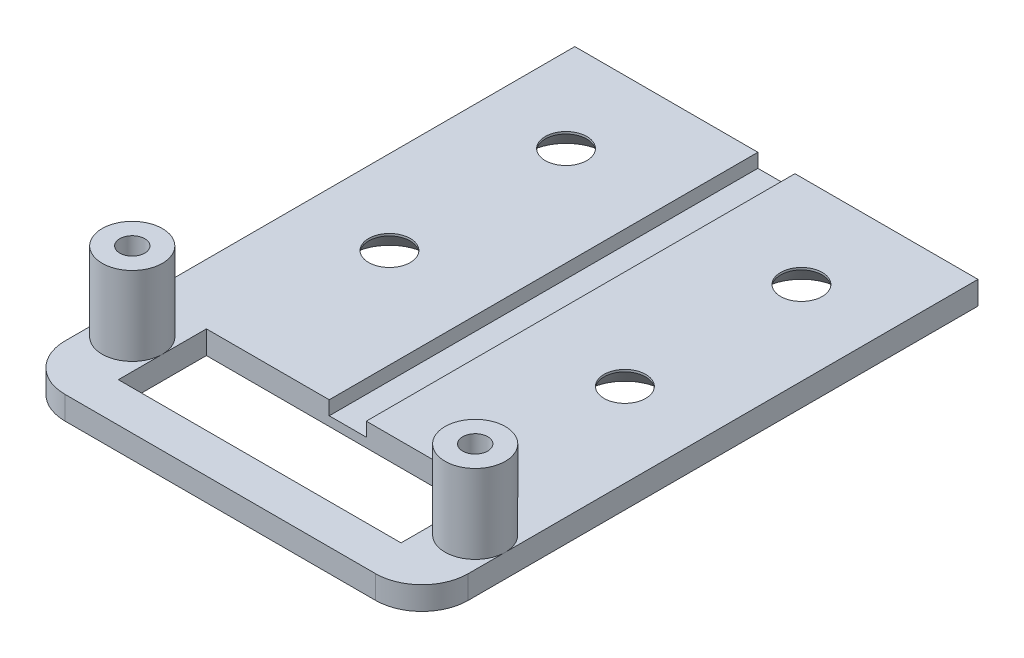
ISO-10303-21;
HEADER;
FILE_DESCRIPTION(('STEP AP214'),'2;1');
FILE_NAME('part.step','',(''),(''),'','','');
FILE_SCHEMA(('AUTOMOTIVE_DESIGN { 1 0 10303 214 1 1 1 1 }'));
ENDSEC;
DATA;
#1=APPLICATION_CONTEXT('core data for automotive mechanical design processes');
#2=APPLICATION_PROTOCOL_DEFINITION('international standard','automotive_design',2000,#1);
#3=PRODUCT_CONTEXT('',#1,'mechanical');
#4=PRODUCT('Part','Part','',(#3));
#5=PRODUCT_RELATED_PRODUCT_CATEGORY('part','',(#4));
#6=PRODUCT_DEFINITION_FORMATION('','',#4);
#7=PRODUCT_DEFINITION_CONTEXT('part definition',#1,'design');
#8=PRODUCT_DEFINITION('design','',#6,#7);
#9=PRODUCT_DEFINITION_SHAPE('','',#8);
#10=(LENGTH_UNIT() NAMED_UNIT(*) SI_UNIT(.MILLI.,.METRE.));
#11=(NAMED_UNIT(*) PLANE_ANGLE_UNIT() SI_UNIT($,.RADIAN.));
#12=(NAMED_UNIT(*) SI_UNIT($,.STERADIAN.) SOLID_ANGLE_UNIT());
#13=UNCERTAINTY_MEASURE_WITH_UNIT(LENGTH_MEASURE(1.E-05),#10,'distance_accuracy_value','');
#14=(GEOMETRIC_REPRESENTATION_CONTEXT(3) GLOBAL_UNCERTAINTY_ASSIGNED_CONTEXT((#13)) GLOBAL_UNIT_ASSIGNED_CONTEXT((#10,
#11,#12)) REPRESENTATION_CONTEXT('',''));
#15=CARTESIAN_POINT('',(0.,0.,0.));
#16=DIRECTION('',(0.,0.,1.));
#17=DIRECTION('',(1.,0.,0.));
#18=AXIS2_PLACEMENT_3D('',#15,#16,#17);
#19=CARTESIAN_POINT('',(0.,2.5,0.));
#20=DIRECTION('',(0.,1.,0.));
#21=DIRECTION('',(0.,0.,1.));
#22=AXIS2_PLACEMENT_3D('',#19,#20,#21);
#23=PLANE('',#22);
#24=CARTESIAN_POINT('',(12.7,2.5,-0.95));
#25=DIRECTION('',(0.,1.,0.));
#26=DIRECTION('',(0.,0.,1.));
#27=AXIS2_PLACEMENT_3D('',#24,#25,#26);
#28=CIRCLE('',#27,2.2479);
#29=CARTESIAN_POINT('',(12.7,2.5,1.2979));
#30=VERTEX_POINT('',#29);
#31=EDGE_CURVE('E37',#30,#30,#28,.T.);
#32=ORIENTED_EDGE('',*,*,#31,.F.);
#33=EDGE_LOOP('',(#32));
#34=FACE_BOUND('',#33,.T.);
#35=CARTESIAN_POINT('',(12.7,2.5,-20.));
#36=DIRECTION('',(0.,1.,0.));
#37=DIRECTION('',(0.,0.,1.));
#38=AXIS2_PLACEMENT_3D('',#35,#36,#37);
#39=CIRCLE('',#38,2.2479);
#40=CARTESIAN_POINT('',(12.7,2.5,-17.7521));
#41=VERTEX_POINT('',#40);
#42=EDGE_CURVE('E295',#41,#41,#39,.T.);
#43=ORIENTED_EDGE('',*,*,#42,.F.);
#44=EDGE_LOOP('',(#43));
#45=FACE_BOUND('',#44,.T.);
#46=DIRECTION('',(0.,0.,-1.));
#47=VECTOR('',#46,1.);
#48=CARTESIAN_POINT('',(2.,2.5,16.25));
#49=LINE('',#48,#47);
#50=CARTESIAN_POINT('',(2.,2.5,16.25));
#51=VERTEX_POINT('',#50);
#52=CARTESIAN_POINT('',(2.,2.5,-30.));
#53=VERTEX_POINT('',#52);
#54=EDGE_CURVE('E154',#51,#53,#49,.T.);
#55=ORIENTED_EDGE('',*,*,#54,.F.);
#56=DIRECTION('',(-1.,0.,0.));
#57=VECTOR('',#56,1.);
#58=CARTESIAN_POINT('',(-15.25,2.5,16.25));
#59=LINE('',#58,#57);
#60=CARTESIAN_POINT('',(15.25,2.5,16.25));
#61=VERTEX_POINT('',#60);
#62=EDGE_CURVE('E229',#61,#51,#59,.T.);
#63=ORIENTED_EDGE('',*,*,#62,.F.);
#64=DIRECTION('',(0.,0.,-1.));
#65=VECTOR('',#64,1.);
#66=CARTESIAN_POINT('',(15.25,2.5,16.25));
#67=LINE('',#66,#65);
#68=CARTESIAN_POINT('',(15.25,2.5,21.));
#69=VERTEX_POINT('',#68);
#70=EDGE_CURVE('E207',#69,#61,#67,.T.);
#71=ORIENTED_EDGE('',*,*,#70,.F.);
#72=CARTESIAN_POINT('',(18.5,2.5,21.));
#73=DIRECTION('',(0.,1.,0.));
#74=DIRECTION('',(0.,0.,1.));
#75=AXIS2_PLACEMENT_3D('',#72,#73,#74);
#76=CIRCLE('',#75,3.25);
#77=CARTESIAN_POINT('',(21.75,2.5,21.));
#78=VERTEX_POINT('',#77);
#79=EDGE_CURVE('E202',#78,#69,#76,.T.);
#80=ORIENTED_EDGE('',*,*,#79,.F.);
#81=DIRECTION('',(0.,0.,-1.));
#82=VECTOR('',#81,1.);
#83=CARTESIAN_POINT('',(21.75,2.5,30.));
#84=LINE('',#83,#82);
#85=CARTESIAN_POINT('',(21.75,2.5,-30.));
#86=VERTEX_POINT('',#85);
#87=EDGE_CURVE('E254',#78,#86,#84,.T.);
#88=ORIENTED_EDGE('',*,*,#87,.T.);
#89=DIRECTION('',(-1.,0.,0.));
#90=VECTOR('',#89,1.);
#91=CARTESIAN_POINT('',(21.75,2.5,-30.));
#92=LINE('',#91,#90);
#93=EDGE_CURVE('E258',#86,#53,#92,.T.);
#94=ORIENTED_EDGE('',*,*,#93,.T.);
#95=EDGE_LOOP('',(#55,#63,#71,#80,#88,#94));
#96=FACE_BOUND('',#95,.T.);
#97=ADVANCED_FACE('F33',(#34,#45,#96),#23,.T.);
#98=CARTESIAN_POINT('',(-12.7,2.5,-0.95));
#99=DIRECTION('',(0.,1.,0.));
#100=DIRECTION('',(0.,0.,1.));
#101=AXIS2_PLACEMENT_3D('',#98,#99,#100);
#102=CIRCLE('',#101,2.2479);
#103=CARTESIAN_POINT('',(-12.7,2.5,1.2979));
#104=VERTEX_POINT('',#103);
#105=EDGE_CURVE('E291',#104,#104,#102,.T.);
#106=ORIENTED_EDGE('',*,*,#105,.F.);
#107=EDGE_LOOP('',(#106));
#108=FACE_BOUND('',#107,.T.);
#109=CARTESIAN_POINT('',(-12.7,2.5,-20.));
#110=DIRECTION('',(0.,1.,0.));
#111=DIRECTION('',(0.,0.,1.));
#112=AXIS2_PLACEMENT_3D('',#109,#110,#111);
#113=CIRCLE('',#112,2.2479);
#114=CARTESIAN_POINT('',(-12.7,2.5,-17.7521));
#115=VERTEX_POINT('',#114);
#116=EDGE_CURVE('E177',#115,#115,#113,.T.);
#117=ORIENTED_EDGE('',*,*,#116,.F.);
#118=EDGE_LOOP('',(#117));
#119=FACE_BOUND('',#118,.T.);
#120=DIRECTION('',(0.,0.,1.));
#121=VECTOR('',#120,1.);
#122=CARTESIAN_POINT('',(-2.,2.5,16.25));
#123=LINE('',#122,#121);
#124=CARTESIAN_POINT('',(-2.,2.5,-30.));
#125=VERTEX_POINT('',#124);
#126=CARTESIAN_POINT('',(-2.,2.5,16.25));
#127=VERTEX_POINT('',#126);
#128=EDGE_CURVE('E167',#125,#127,#123,.T.);
#129=ORIENTED_EDGE('',*,*,#128,.F.);
#130=CARTESIAN_POINT('',(-21.75,2.5,-30.));
#131=VERTEX_POINT('',#130);
#132=EDGE_CURVE('E257',#125,#131,#92,.T.);
#133=ORIENTED_EDGE('',*,*,#132,.T.);
#134=DIRECTION('',(0.,0.,1.));
#135=VECTOR('',#134,1.);
#136=CARTESIAN_POINT('',(-21.75,2.5,30.));
#137=LINE('',#136,#135);
#138=CARTESIAN_POINT('',(-21.75,2.5,21.));
#139=VERTEX_POINT('',#138);
#140=EDGE_CURVE('E248',#131,#139,#137,.T.);
#141=ORIENTED_EDGE('',*,*,#140,.T.);
#142=CARTESIAN_POINT('',(-18.5,2.5,21.));
#143=DIRECTION('',(0.,1.,0.));
#144=DIRECTION('',(0.,0.,1.));
#145=AXIS2_PLACEMENT_3D('',#142,#143,#144);
#146=CIRCLE('',#145,3.25);
#147=CARTESIAN_POINT('',(-15.25,2.5,21.));
#148=VERTEX_POINT('',#147);
#149=EDGE_CURVE('E201',#148,#139,#146,.T.);
#150=ORIENTED_EDGE('',*,*,#149,.F.);
#151=DIRECTION('',(0.,0.,1.));
#152=VECTOR('',#151,1.);
#153=CARTESIAN_POINT('',(-15.25,2.5,16.25));
#154=LINE('',#153,#152);
#155=CARTESIAN_POINT('',(-15.25,2.5,16.25));
#156=VERTEX_POINT('',#155);
#157=EDGE_CURVE('E233',#156,#148,#154,.T.);
#158=ORIENTED_EDGE('',*,*,#157,.F.);
#159=EDGE_CURVE('E228',#127,#156,#59,.T.);
#160=ORIENTED_EDGE('',*,*,#159,.F.);
#161=EDGE_LOOP('',(#129,#133,#141,#150,#158,#160));
#162=FACE_BOUND('',#161,.T.);
#163=ADVANCED_FACE('F365',(#108,#119,#162),#23,.T.);
#164=CARTESIAN_POINT('',(-21.75,2.5,30.));
#165=DIRECTION('',(1.,0.,0.));
#166=DIRECTION('',(0.,0.,-1.));
#167=AXIS2_PLACEMENT_3D('',#164,#165,#166);
#168=PLANE('',#167);
#169=DIRECTION('',(0.,0.,1.));
#170=VECTOR('',#169,1.);
#171=CARTESIAN_POINT('',(-21.75,0.,30.));
#172=LINE('',#171,#170);
#173=CARTESIAN_POINT('',(-21.75,0.,-30.));
#174=VERTEX_POINT('',#173);
#175=CARTESIAN_POINT('',(-21.75,0.,25.));
#176=VERTEX_POINT('',#175);
#177=EDGE_CURVE('E239',#174,#176,#172,.T.);
#178=ORIENTED_EDGE('',*,*,#177,.T.);
#179=DIRECTION('',(0.,-1.,0.));
#180=VECTOR('',#179,1.);
#181=CARTESIAN_POINT('',(-21.75,2.5,25.));
#182=LINE('',#181,#180);
#183=CARTESIAN_POINT('',(-21.75,2.5,25.));
#184=VERTEX_POINT('',#183);
#185=EDGE_CURVE('E284',#176,#184,#182,.F.);
#186=ORIENTED_EDGE('',*,*,#185,.T.);
#187=EDGE_CURVE('E252',#139,#184,#137,.T.);
#188=ORIENTED_EDGE('',*,*,#187,.F.);
#189=ORIENTED_EDGE('',*,*,#140,.F.);
#190=DIRECTION('',(0.,-1.,0.));
#191=VECTOR('',#190,1.);
#192=CARTESIAN_POINT('',(-21.75,2.5,-30.));
#193=LINE('',#192,#191);
#194=EDGE_CURVE('E260',#131,#174,#193,.T.);
#195=ORIENTED_EDGE('',*,*,#194,.T.);
#196=EDGE_LOOP('',(#178,#186,#188,#189,#195));
#197=FACE_BOUND('',#196,.T.);
#198=ADVANCED_FACE('F358',(#197),#168,.F.);
#199=CARTESIAN_POINT('',(21.75,2.5,30.));
#200=DIRECTION('',(0.,0.,-1.));
#201=DIRECTION('',(-1.,0.,0.));
#202=AXIS2_PLACEMENT_3D('',#199,#200,#201);
#203=PLANE('',#202);
#204=DIRECTION('',(1.,0.,0.));
#205=VECTOR('',#204,1.);
#206=CARTESIAN_POINT('',(21.75,2.5,30.));
#207=LINE('',#206,#205);
#208=CARTESIAN_POINT('',(-16.75,2.5,30.));
#209=VERTEX_POINT('',#208);
#210=CARTESIAN_POINT('',(16.75,2.5,30.));
#211=VERTEX_POINT('',#210);
#212=EDGE_CURVE('E251',#209,#211,#207,.T.);
#213=ORIENTED_EDGE('',*,*,#212,.F.);
#214=DIRECTION('',(0.,-1.,0.));
#215=VECTOR('',#214,1.);
#216=CARTESIAN_POINT('',(-16.75,2.5,30.));
#217=LINE('',#216,#215);
#218=CARTESIAN_POINT('',(-16.75,0.,30.));
#219=VERTEX_POINT('',#218);
#220=EDGE_CURVE('E277',#209,#219,#217,.T.);
#221=ORIENTED_EDGE('',*,*,#220,.T.);
#222=DIRECTION('',(1.,0.,0.));
#223=VECTOR('',#222,1.);
#224=CARTESIAN_POINT('',(21.75,0.,30.));
#225=LINE('',#224,#223);
#226=CARTESIAN_POINT('',(16.75,0.,30.));
#227=VERTEX_POINT('',#226);
#228=EDGE_CURVE('E263',#219,#227,#225,.T.);
#229=ORIENTED_EDGE('',*,*,#228,.T.);
#230=DIRECTION('',(0.,-1.,0.));
#231=VECTOR('',#230,1.);
#232=CARTESIAN_POINT('',(16.75,2.5,30.));
#233=LINE('',#232,#231);
#234=EDGE_CURVE('E275',#227,#211,#233,.F.);
#235=ORIENTED_EDGE('',*,*,#234,.T.);
#236=EDGE_LOOP('',(#213,#221,#229,#235));
#237=FACE_BOUND('',#236,.T.);
#238=ADVANCED_FACE('F346',(#237),#203,.F.);
#239=CARTESIAN_POINT('',(21.75,2.5,30.));
#240=DIRECTION('',(-1.,0.,0.));
#241=DIRECTION('',(0.,0.,1.));
#242=AXIS2_PLACEMENT_3D('',#239,#240,#241);
#243=PLANE('',#242);
#244=CARTESIAN_POINT('',(21.75,2.5,25.));
#245=VERTEX_POINT('',#244);
#246=EDGE_CURVE('E255',#245,#78,#84,.T.);
#247=ORIENTED_EDGE('',*,*,#246,.F.);
#248=DIRECTION('',(0.,-1.,0.));
#249=VECTOR('',#248,1.);
#250=CARTESIAN_POINT('',(21.75,2.5,25.));
#251=LINE('',#250,#249);
#252=CARTESIAN_POINT('',(21.75,0.,25.));
#253=VERTEX_POINT('',#252);
#254=EDGE_CURVE('E11',#245,#253,#251,.T.);
#255=ORIENTED_EDGE('',*,*,#254,.T.);
#256=DIRECTION('',(0.,0.,-1.));
#257=VECTOR('',#256,1.);
#258=CARTESIAN_POINT('',(21.75,0.,30.));
#259=LINE('',#258,#257);
#260=CARTESIAN_POINT('',(21.75,0.,-30.));
#261=VERTEX_POINT('',#260);
#262=EDGE_CURVE('E266',#253,#261,#259,.T.);
#263=ORIENTED_EDGE('',*,*,#262,.T.);
#264=DIRECTION('',(0.,-1.,0.));
#265=VECTOR('',#264,1.);
#266=CARTESIAN_POINT('',(21.75,2.5,-30.));
#267=LINE('',#266,#265);
#268=EDGE_CURVE('E272',#86,#261,#267,.T.);
#269=ORIENTED_EDGE('',*,*,#268,.F.);
#270=ORIENTED_EDGE('',*,*,#87,.F.);
#271=EDGE_LOOP('',(#247,#255,#263,#269,#270));
#272=FACE_BOUND('',#271,.T.);
#273=ADVANCED_FACE('F351',(#272),#243,.F.);
#274=CARTESIAN_POINT('',(21.75,2.5,-30.));
#275=DIRECTION('',(0.,0.,1.));
#276=DIRECTION('',(1.,0.,0.));
#277=AXIS2_PLACEMENT_3D('',#274,#275,#276);
#278=PLANE('',#277);
#279=DIRECTION('',(-1.,0.,0.));
#280=VECTOR('',#279,1.);
#281=CARTESIAN_POINT('',(-2.,1.,-30.));
#282=LINE('',#281,#280);
#283=CARTESIAN_POINT('',(2.,1.,-30.));
#284=VERTEX_POINT('',#283);
#285=CARTESIAN_POINT('',(-2.,1.,-30.));
#286=VERTEX_POINT('',#285);
#287=EDGE_CURVE('E163',#284,#286,#282,.T.);
#288=ORIENTED_EDGE('',*,*,#287,.F.);
#289=DIRECTION('',(0.,1.,0.));
#290=VECTOR('',#289,1.);
#291=CARTESIAN_POINT('',(2.,1.,-30.));
#292=LINE('',#291,#290);
#293=EDGE_CURVE('E149',#284,#53,#292,.T.);
#294=ORIENTED_EDGE('',*,*,#293,.T.);
#295=ORIENTED_EDGE('',*,*,#93,.F.);
#296=ORIENTED_EDGE('',*,*,#268,.T.);
#297=DIRECTION('',(-1.,0.,0.));
#298=VECTOR('',#297,1.);
#299=CARTESIAN_POINT('',(21.75,0.,-30.));
#300=LINE('',#299,#298);
#301=EDGE_CURVE('E268',#261,#174,#300,.T.);
#302=ORIENTED_EDGE('',*,*,#301,.T.);
#303=ORIENTED_EDGE('',*,*,#194,.F.);
#304=ORIENTED_EDGE('',*,*,#132,.F.);
#305=DIRECTION('',(0.,1.,0.));
#306=VECTOR('',#305,1.);
#307=CARTESIAN_POINT('',(-2.,1.,-30.));
#308=LINE('',#307,#306);
#309=EDGE_CURVE('E159',#286,#125,#308,.T.);
#310=ORIENTED_EDGE('',*,*,#309,.F.);
#311=EDGE_LOOP('',(#288,#294,#295,#296,#302,#303,#304,#310));
#312=FACE_BOUND('',#311,.T.);
#313=ADVANCED_FACE('F169',(#312),#278,.F.);
#314=ORIENTED_EDGE('',*,*,#187,.T.);
#315=CARTESIAN_POINT('',(-16.75,2.5,25.));
#316=DIRECTION('',(0.,1.,0.));
#317=DIRECTION('',(0.,0.,1.));
#318=AXIS2_PLACEMENT_3D('',#315,#316,#317);
#319=CIRCLE('',#318,5.);
#320=EDGE_CURVE('E42',#184,#209,#319,.T.);
#321=ORIENTED_EDGE('',*,*,#320,.T.);
#322=ORIENTED_EDGE('',*,*,#212,.T.);
#323=CARTESIAN_POINT('',(16.75,2.5,25.));
#324=DIRECTION('',(0.,1.,0.));
#325=DIRECTION('',(0.,0.,1.));
#326=AXIS2_PLACEMENT_3D('',#323,#324,#325);
#327=CIRCLE('',#326,5.);
#328=EDGE_CURVE('E58',#211,#245,#327,.T.);
#329=ORIENTED_EDGE('',*,*,#328,.T.);
#330=ORIENTED_EDGE('',*,*,#246,.T.);
#331=EDGE_CURVE('E197',#69,#78,#76,.T.);
#332=ORIENTED_EDGE('',*,*,#331,.F.);
#333=CARTESIAN_POINT('',(15.25,2.5,25.75));
#334=VERTEX_POINT('',#333);
#335=EDGE_CURVE('E225',#334,#69,#67,.T.);
#336=ORIENTED_EDGE('',*,*,#335,.F.);
#337=DIRECTION('',(1.,0.,0.));
#338=VECTOR('',#337,1.);
#339=CARTESIAN_POINT('',(-15.25,2.5,25.75));
#340=LINE('',#339,#338);
#341=CARTESIAN_POINT('',(-15.25,2.5,25.75));
#342=VERTEX_POINT('',#341);
#343=EDGE_CURVE('E215',#342,#334,#340,.T.);
#344=ORIENTED_EDGE('',*,*,#343,.F.);
#345=EDGE_CURVE('E232',#148,#342,#154,.T.);
#346=ORIENTED_EDGE('',*,*,#345,.F.);
#347=EDGE_CURVE('E210',#139,#148,#146,.T.);
#348=ORIENTED_EDGE('',*,*,#347,.F.);
#349=EDGE_LOOP('',(#314,#321,#322,#329,#330,#332,#336,#344,#346,#348));
#350=FACE_BOUND('',#349,.T.);
#351=ADVANCED_FACE('F331',(#350),#23,.T.);
#352=CARTESIAN_POINT('',(0.,0.,0.));
#353=DIRECTION('',(0.,1.,0.));
#354=DIRECTION('',(0.,0.,1.));
#355=AXIS2_PLACEMENT_3D('',#352,#353,#354);
#356=PLANE('',#355);
#357=CARTESIAN_POINT('',(12.7,0.,-0.95));
#358=DIRECTION('',(0.,-1.,0.));
#359=DIRECTION('',(0.,0.,-1.));
#360=AXIS2_PLACEMENT_3D('',#357,#358,#359);
#361=CIRCLE('',#360,4.2164);
#362=CARTESIAN_POINT('',(12.7,0.,-5.1664));
#363=VERTEX_POINT('',#362);
#364=EDGE_CURVE('E568',#363,#363,#361,.T.);
#365=ORIENTED_EDGE('',*,*,#364,.F.);
#366=EDGE_LOOP('',(#365));
#367=FACE_BOUND('',#366,.T.);
#368=CARTESIAN_POINT('',(12.7,0.,-20.));
#369=DIRECTION('',(0.,-1.,0.));
#370=DIRECTION('',(0.,0.,-1.));
#371=AXIS2_PLACEMENT_3D('',#368,#369,#370);
#372=CIRCLE('',#371,4.2164);
#373=CARTESIAN_POINT('',(12.7,0.,-24.2164));
#374=VERTEX_POINT('',#373);
#375=EDGE_CURVE('E304',#374,#374,#372,.T.);
#376=ORIENTED_EDGE('',*,*,#375,.F.);
#377=EDGE_LOOP('',(#376));
#378=FACE_BOUND('',#377,.T.);
#379=CARTESIAN_POINT('',(-12.7,0.,-0.95));
#380=DIRECTION('',(0.,-1.,0.));
#381=DIRECTION('',(0.,0.,-1.));
#382=AXIS2_PLACEMENT_3D('',#379,#380,#381);
#383=CIRCLE('',#382,4.2164);
#384=CARTESIAN_POINT('',(-12.7,0.,-5.1664));
#385=VERTEX_POINT('',#384);
#386=EDGE_CURVE('E297',#385,#385,#383,.T.);
#387=ORIENTED_EDGE('',*,*,#386,.F.);
#388=EDGE_LOOP('',(#387));
#389=FACE_BOUND('',#388,.T.);
#390=CARTESIAN_POINT('',(-12.7,0.,-20.));
#391=DIRECTION('',(0.,-1.,0.));
#392=DIRECTION('',(0.,0.,-1.));
#393=AXIS2_PLACEMENT_3D('',#390,#391,#392);
#394=CIRCLE('',#393,4.2164);
#395=CARTESIAN_POINT('',(-12.7,0.,-24.2164));
#396=VERTEX_POINT('',#395);
#397=EDGE_CURVE('E293',#396,#396,#394,.T.);
#398=ORIENTED_EDGE('',*,*,#397,.F.);
#399=EDGE_LOOP('',(#398));
#400=FACE_BOUND('',#399,.T.);
#401=CARTESIAN_POINT('',(-18.5,0.,21.));
#402=DIRECTION('',(0.,1.,0.));
#403=DIRECTION('',(0.,0.,1.));
#404=AXIS2_PLACEMENT_3D('',#401,#402,#403);
#405=CIRCLE('',#404,1.35);
#406=CARTESIAN_POINT('',(-18.5,0.,22.35));
#407=VERTEX_POINT('',#406);
#408=EDGE_CURVE('E188',#407,#407,#405,.T.);
#409=ORIENTED_EDGE('',*,*,#408,.T.);
#410=EDGE_LOOP('',(#409));
#411=FACE_BOUND('',#410,.T.);
#412=CARTESIAN_POINT('',(18.5,0.,21.));
#413=DIRECTION('',(0.,1.,0.));
#414=DIRECTION('',(0.,0.,1.));
#415=AXIS2_PLACEMENT_3D('',#412,#413,#414);
#416=CIRCLE('',#415,1.35);
#417=CARTESIAN_POINT('',(18.5,0.,22.35));
#418=VERTEX_POINT('',#417);
#419=EDGE_CURVE('E194',#418,#418,#416,.T.);
#420=ORIENTED_EDGE('',*,*,#419,.T.);
#421=EDGE_LOOP('',(#420));
#422=FACE_BOUND('',#421,.T.);
#423=DIRECTION('',(1.,0.,0.));
#424=VECTOR('',#423,1.);
#425=CARTESIAN_POINT('',(-15.25,0.,25.75));
#426=LINE('',#425,#424);
#427=CARTESIAN_POINT('',(-15.25,0.,25.75));
#428=VERTEX_POINT('',#427);
#429=CARTESIAN_POINT('',(15.25,0.,25.75));
#430=VERTEX_POINT('',#429);
#431=EDGE_CURVE('E221',#428,#430,#426,.T.);
#432=ORIENTED_EDGE('',*,*,#431,.T.);
#433=DIRECTION('',(0.,0.,-1.));
#434=VECTOR('',#433,1.);
#435=CARTESIAN_POINT('',(15.25,0.,16.25));
#436=LINE('',#435,#434);
#437=CARTESIAN_POINT('',(15.25,0.,16.25));
#438=VERTEX_POINT('',#437);
#439=EDGE_CURVE('E211',#430,#438,#436,.T.);
#440=ORIENTED_EDGE('',*,*,#439,.T.);
#441=DIRECTION('',(-1.,0.,0.));
#442=VECTOR('',#441,1.);
#443=CARTESIAN_POINT('',(-15.25,0.,16.25));
#444=LINE('',#443,#442);
#445=CARTESIAN_POINT('',(-15.25,0.,16.25));
#446=VERTEX_POINT('',#445);
#447=EDGE_CURVE('E214',#438,#446,#444,.T.);
#448=ORIENTED_EDGE('',*,*,#447,.T.);
#449=DIRECTION('',(0.,0.,1.));
#450=VECTOR('',#449,1.);
#451=CARTESIAN_POINT('',(-15.25,0.,16.25));
#452=LINE('',#451,#450);
#453=EDGE_CURVE('E218',#446,#428,#452,.T.);
#454=ORIENTED_EDGE('',*,*,#453,.T.);
#455=EDGE_LOOP('',(#432,#440,#448,#454));
#456=FACE_BOUND('',#455,.T.);
#457=ORIENTED_EDGE('',*,*,#228,.F.);
#458=CARTESIAN_POINT('',(-16.75,0.,25.));
#459=DIRECTION('',(0.,1.,0.));
#460=DIRECTION('',(0.,0.,1.));
#461=AXIS2_PLACEMENT_3D('',#458,#459,#460);
#462=CIRCLE('',#461,5.);
#463=EDGE_CURVE('E282',#219,#176,#462,.F.);
#464=ORIENTED_EDGE('',*,*,#463,.T.);
#465=ORIENTED_EDGE('',*,*,#177,.F.);
#466=ORIENTED_EDGE('',*,*,#301,.F.);
#467=ORIENTED_EDGE('',*,*,#262,.F.);
#468=CARTESIAN_POINT('',(16.75,0.,25.));
#469=DIRECTION('',(0.,1.,0.));
#470=DIRECTION('',(0.,0.,1.));
#471=AXIS2_PLACEMENT_3D('',#468,#469,#470);
#472=CIRCLE('',#471,5.);
#473=EDGE_CURVE('E280',#253,#227,#472,.F.);
#474=ORIENTED_EDGE('',*,*,#473,.T.);
#475=EDGE_LOOP('',(#457,#464,#465,#466,#467,#474));
#476=FACE_BOUND('',#475,.T.);
#477=ADVANCED_FACE('F327',(#367,#378,#389,#400,#411,#422,#456,#476),#356,.F.);
#478=CARTESIAN_POINT('',(15.25,0.,16.25));
#479=DIRECTION('',(1.,0.,0.));
#480=DIRECTION('',(0.,0.,-1.));
#481=AXIS2_PLACEMENT_3D('',#478,#479,#480);
#482=PLANE('',#481);
#483=ORIENTED_EDGE('',*,*,#335,.T.);
#484=ORIENTED_EDGE('',*,*,#70,.T.);
#485=DIRECTION('',(0.,1.,0.));
#486=VECTOR('',#485,1.);
#487=CARTESIAN_POINT('',(15.25,0.,16.25));
#488=LINE('',#487,#486);
#489=EDGE_CURVE('E224',#438,#61,#488,.T.);
#490=ORIENTED_EDGE('',*,*,#489,.F.);
#491=ORIENTED_EDGE('',*,*,#439,.F.);
#492=DIRECTION('',(0.,1.,0.));
#493=VECTOR('',#492,1.);
#494=CARTESIAN_POINT('',(15.25,0.,25.75));
#495=LINE('',#494,#493);
#496=EDGE_CURVE('E237',#430,#334,#495,.T.);
#497=ORIENTED_EDGE('',*,*,#496,.T.);
#498=EDGE_LOOP('',(#483,#484,#490,#491,#497));
#499=FACE_BOUND('',#498,.T.);
#500=ADVANCED_FACE('F330',(#499),#482,.F.);
#501=CARTESIAN_POINT('',(-15.25,0.,25.75));
#502=DIRECTION('',(0.,0.,1.));
#503=DIRECTION('',(1.,0.,0.));
#504=AXIS2_PLACEMENT_3D('',#501,#502,#503);
#505=PLANE('',#504);
#506=ORIENTED_EDGE('',*,*,#343,.T.);
#507=ORIENTED_EDGE('',*,*,#496,.F.);
#508=ORIENTED_EDGE('',*,*,#431,.F.);
#509=DIRECTION('',(0.,1.,0.));
#510=VECTOR('',#509,1.);
#511=CARTESIAN_POINT('',(-15.25,0.,25.75));
#512=LINE('',#511,#510);
#513=EDGE_CURVE('E240',#428,#342,#512,.T.);
#514=ORIENTED_EDGE('',*,*,#513,.T.);
#515=EDGE_LOOP('',(#506,#507,#508,#514));
#516=FACE_BOUND('',#515,.T.);
#517=ADVANCED_FACE('F377',(#516),#505,.F.);
#518=CARTESIAN_POINT('',(-15.25,0.,16.25));
#519=DIRECTION('',(-1.,0.,0.));
#520=DIRECTION('',(0.,0.,1.));
#521=AXIS2_PLACEMENT_3D('',#518,#519,#520);
#522=PLANE('',#521);
#523=ORIENTED_EDGE('',*,*,#157,.T.);
#524=ORIENTED_EDGE('',*,*,#345,.T.);
#525=ORIENTED_EDGE('',*,*,#513,.F.);
#526=ORIENTED_EDGE('',*,*,#453,.F.);
#527=DIRECTION('',(0.,1.,0.));
#528=VECTOR('',#527,1.);
#529=CARTESIAN_POINT('',(-15.25,0.,16.25));
#530=LINE('',#529,#528);
#531=EDGE_CURVE('E243',#446,#156,#530,.T.);
#532=ORIENTED_EDGE('',*,*,#531,.T.);
#533=EDGE_LOOP('',(#523,#524,#525,#526,#532));
#534=FACE_BOUND('',#533,.T.);
#535=ADVANCED_FACE('F375',(#534),#522,.F.);
#536=CARTESIAN_POINT('',(-15.25,0.,16.25));
#537=DIRECTION('',(0.,0.,-1.));
#538=DIRECTION('',(-1.,0.,0.));
#539=AXIS2_PLACEMENT_3D('',#536,#537,#538);
#540=PLANE('',#539);
#541=ORIENTED_EDGE('',*,*,#62,.T.);
#542=DIRECTION('',(0.,1.,0.));
#543=VECTOR('',#542,1.);
#544=CARTESIAN_POINT('',(2.,1.,16.25));
#545=LINE('',#544,#543);
#546=CARTESIAN_POINT('',(2.,1.,16.25));
#547=VERTEX_POINT('',#546);
#548=EDGE_CURVE('E179',#547,#51,#545,.T.);
#549=ORIENTED_EDGE('',*,*,#548,.F.);
#550=DIRECTION('',(1.,0.,0.));
#551=VECTOR('',#550,1.);
#552=CARTESIAN_POINT('',(-2.,1.,16.25));
#553=LINE('',#552,#551);
#554=CARTESIAN_POINT('',(-2.,1.,16.25));
#555=VERTEX_POINT('',#554);
#556=EDGE_CURVE('E160',#555,#547,#553,.T.);
#557=ORIENTED_EDGE('',*,*,#556,.F.);
#558=DIRECTION('',(0.,1.,0.));
#559=VECTOR('',#558,1.);
#560=CARTESIAN_POINT('',(-2.,1.,16.25));
#561=LINE('',#560,#559);
#562=EDGE_CURVE('E182',#555,#127,#561,.T.);
#563=ORIENTED_EDGE('',*,*,#562,.T.);
#564=ORIENTED_EDGE('',*,*,#159,.T.);
#565=ORIENTED_EDGE('',*,*,#531,.F.);
#566=ORIENTED_EDGE('',*,*,#447,.F.);
#567=ORIENTED_EDGE('',*,*,#489,.T.);
#568=EDGE_LOOP('',(#541,#549,#557,#563,#564,#565,#566,#567));
#569=FACE_BOUND('',#568,.T.);
#570=ADVANCED_FACE('F382',(#569),#540,.F.);
#571=CARTESIAN_POINT('',(-18.5,11.,21.));
#572=DIRECTION('',(0.,-1.,0.));
#573=DIRECTION('',(0.,0.,-1.));
#574=AXIS2_PLACEMENT_3D('',#571,#572,#573);
#575=CYLINDRICAL_SURFACE('',#574,3.25);
#576=CARTESIAN_POINT('',(-18.5,11.,21.));
#577=DIRECTION('',(0.,1.,0.));
#578=DIRECTION('',(0.,0.,1.));
#579=AXIS2_PLACEMENT_3D('',#576,#577,#578);
#580=CIRCLE('',#579,3.25);
#581=CARTESIAN_POINT('',(-18.5,11.,24.25));
#582=VERTEX_POINT('',#581);
#583=EDGE_CURVE('E204',#582,#582,#580,.T.);
#584=ORIENTED_EDGE('',*,*,#583,.F.);
#585=EDGE_LOOP('',(#584));
#586=FACE_BOUND('',#585,.T.);
#587=ORIENTED_EDGE('',*,*,#149,.T.);
#588=ORIENTED_EDGE('',*,*,#347,.T.);
#589=EDGE_LOOP('',(#587,#588));
#590=FACE_BOUND('',#589,.T.);
#591=ADVANCED_FACE('F369',(#586,#590),#575,.T.);
#592=CARTESIAN_POINT('',(-18.5,11.,21.));
#593=DIRECTION('',(0.,1.,0.));
#594=DIRECTION('',(0.,0.,1.));
#595=AXIS2_PLACEMENT_3D('',#592,#593,#594);
#596=PLANE('',#595);
#597=CARTESIAN_POINT('',(-18.5,11.,21.));
#598=DIRECTION('',(0.,1.,0.));
#599=DIRECTION('',(0.,0.,1.));
#600=AXIS2_PLACEMENT_3D('',#597,#598,#599);
#601=CIRCLE('',#600,1.35);
#602=CARTESIAN_POINT('',(-18.5,11.,22.35));
#603=VERTEX_POINT('',#602);
#604=EDGE_CURVE('E181',#603,#603,#601,.T.);
#605=ORIENTED_EDGE('',*,*,#604,.F.);
#606=EDGE_LOOP('',(#605));
#607=FACE_BOUND('',#606,.T.);
#608=ORIENTED_EDGE('',*,*,#583,.T.);
#609=EDGE_LOOP('',(#608));
#610=FACE_BOUND('',#609,.T.);
#611=ADVANCED_FACE('F454',(#607,#610),#596,.T.);
#612=CARTESIAN_POINT('',(18.5,11.,21.));
#613=DIRECTION('',(0.,-1.,0.));
#614=DIRECTION('',(0.,0.,-1.));
#615=AXIS2_PLACEMENT_3D('',#612,#613,#614);
#616=CYLINDRICAL_SURFACE('',#615,3.25);
#617=CARTESIAN_POINT('',(18.5,11.,21.));
#618=DIRECTION('',(0.,1.,0.));
#619=DIRECTION('',(0.,0.,1.));
#620=AXIS2_PLACEMENT_3D('',#617,#618,#619);
#621=CIRCLE('',#620,3.25);
#622=CARTESIAN_POINT('',(18.5,11.,24.25));
#623=VERTEX_POINT('',#622);
#624=EDGE_CURVE('E198',#623,#623,#621,.T.);
#625=ORIENTED_EDGE('',*,*,#624,.F.);
#626=EDGE_LOOP('',(#625));
#627=FACE_BOUND('',#626,.T.);
#628=ORIENTED_EDGE('',*,*,#79,.T.);
#629=ORIENTED_EDGE('',*,*,#331,.T.);
#630=EDGE_LOOP('',(#628,#629));
#631=FACE_BOUND('',#630,.T.);
#632=ADVANCED_FACE('F393',(#627,#631),#616,.T.);
#633=CARTESIAN_POINT('',(18.5,11.,21.));
#634=DIRECTION('',(0.,1.,0.));
#635=DIRECTION('',(0.,0.,1.));
#636=AXIS2_PLACEMENT_3D('',#633,#634,#635);
#637=PLANE('',#636);
#638=CARTESIAN_POINT('',(18.5,11.,21.));
#639=DIRECTION('',(0.,1.,0.));
#640=DIRECTION('',(0.,0.,1.));
#641=AXIS2_PLACEMENT_3D('',#638,#639,#640);
#642=CIRCLE('',#641,1.35);
#643=CARTESIAN_POINT('',(18.5,11.,22.35));
#644=VERTEX_POINT('',#643);
#645=EDGE_CURVE('E191',#644,#644,#642,.T.);
#646=ORIENTED_EDGE('',*,*,#645,.F.);
#647=EDGE_LOOP('',(#646));
#648=FACE_BOUND('',#647,.T.);
#649=ORIENTED_EDGE('',*,*,#624,.T.);
#650=EDGE_LOOP('',(#649));
#651=FACE_BOUND('',#650,.T.);
#652=ADVANCED_FACE('F442',(#648,#651),#637,.T.);
#653=CARTESIAN_POINT('',(18.5,11.,21.));
#654=DIRECTION('',(0.,1.,0.));
#655=DIRECTION('',(0.,0.,1.));
#656=AXIS2_PLACEMENT_3D('',#653,#654,#655);
#657=CYLINDRICAL_SURFACE('',#656,1.35);
#658=ORIENTED_EDGE('',*,*,#419,.F.);
#659=EDGE_LOOP('',(#658));
#660=FACE_BOUND('',#659,.T.);
#661=ORIENTED_EDGE('',*,*,#645,.T.);
#662=EDGE_LOOP('',(#661));
#663=FACE_BOUND('',#662,.T.);
#664=ADVANCED_FACE('F436',(#660,#663),#657,.F.);
#665=CARTESIAN_POINT('',(-18.5,11.,21.));
#666=DIRECTION('',(0.,1.,0.));
#667=DIRECTION('',(0.,0.,1.));
#668=AXIS2_PLACEMENT_3D('',#665,#666,#667);
#669=CYLINDRICAL_SURFACE('',#668,1.35);
#670=ORIENTED_EDGE('',*,*,#408,.F.);
#671=EDGE_LOOP('',(#670));
#672=FACE_BOUND('',#671,.T.);
#673=ORIENTED_EDGE('',*,*,#604,.T.);
#674=EDGE_LOOP('',(#673));
#675=FACE_BOUND('',#674,.T.);
#676=ADVANCED_FACE('F430',(#672,#675),#669,.F.);
#677=CARTESIAN_POINT('',(-16.75,2.5,25.));
#678=DIRECTION('',(0.,-1.,0.));
#679=DIRECTION('',(0.,0.,-1.));
#680=AXIS2_PLACEMENT_3D('',#677,#678,#679);
#681=CYLINDRICAL_SURFACE('',#680,5.);
#682=ORIENTED_EDGE('',*,*,#320,.F.);
#683=ORIENTED_EDGE('',*,*,#185,.F.);
#684=ORIENTED_EDGE('',*,*,#463,.F.);
#685=ORIENTED_EDGE('',*,*,#220,.F.);
#686=EDGE_LOOP('',(#682,#683,#684,#685));
#687=FACE_BOUND('',#686,.T.);
#688=ADVANCED_FACE('F428',(#687),#681,.T.);
#689=CARTESIAN_POINT('',(16.75,2.5,25.));
#690=DIRECTION('',(0.,-1.,0.));
#691=DIRECTION('',(0.,0.,-1.));
#692=AXIS2_PLACEMENT_3D('',#689,#690,#691);
#693=CYLINDRICAL_SURFACE('',#692,5.);
#694=ORIENTED_EDGE('',*,*,#328,.F.);
#695=ORIENTED_EDGE('',*,*,#234,.F.);
#696=ORIENTED_EDGE('',*,*,#473,.F.);
#697=ORIENTED_EDGE('',*,*,#254,.F.);
#698=EDGE_LOOP('',(#694,#695,#696,#697));
#699=FACE_BOUND('',#698,.T.);
#700=ADVANCED_FACE('F35',(#699),#693,.T.);
#701=CARTESIAN_POINT('',(2.,1.,16.25));
#702=DIRECTION('',(1.,0.,0.));
#703=DIRECTION('',(0.,0.,-1.));
#704=AXIS2_PLACEMENT_3D('',#701,#702,#703);
#705=PLANE('',#704);
#706=ORIENTED_EDGE('',*,*,#54,.T.);
#707=ORIENTED_EDGE('',*,*,#293,.F.);
#708=DIRECTION('',(0.,0.,-1.));
#709=VECTOR('',#708,1.);
#710=CARTESIAN_POINT('',(2.,1.,16.25));
#711=LINE('',#710,#709);
#712=EDGE_CURVE('E152',#547,#284,#711,.T.);
#713=ORIENTED_EDGE('',*,*,#712,.F.);
#714=ORIENTED_EDGE('',*,*,#548,.T.);
#715=EDGE_LOOP('',(#706,#707,#713,#714));
#716=FACE_BOUND('',#715,.T.);
#717=ADVANCED_FACE('F151',(#716),#705,.F.);
#718=CARTESIAN_POINT('',(-2.,1.,16.25));
#719=DIRECTION('',(-1.,0.,0.));
#720=DIRECTION('',(0.,0.,1.));
#721=AXIS2_PLACEMENT_3D('',#718,#719,#720);
#722=PLANE('',#721);
#723=ORIENTED_EDGE('',*,*,#128,.T.);
#724=ORIENTED_EDGE('',*,*,#562,.F.);
#725=DIRECTION('',(0.,0.,1.));
#726=VECTOR('',#725,1.);
#727=CARTESIAN_POINT('',(-2.,1.,16.25));
#728=LINE('',#727,#726);
#729=EDGE_CURVE('E50',#286,#555,#728,.T.);
#730=ORIENTED_EDGE('',*,*,#729,.F.);
#731=ORIENTED_EDGE('',*,*,#309,.T.);
#732=EDGE_LOOP('',(#723,#724,#730,#731));
#733=FACE_BOUND('',#732,.T.);
#734=ADVANCED_FACE('F385',(#733),#722,.F.);
#735=CARTESIAN_POINT('',(0.,1.,0.));
#736=DIRECTION('',(0.,-1.,0.));
#737=DIRECTION('',(0.,0.,-1.));
#738=AXIS2_PLACEMENT_3D('',#735,#736,#737);
#739=PLANE('',#738);
#740=ORIENTED_EDGE('',*,*,#712,.T.);
#741=ORIENTED_EDGE('',*,*,#287,.T.);
#742=ORIENTED_EDGE('',*,*,#729,.T.);
#743=ORIENTED_EDGE('',*,*,#556,.T.);
#744=EDGE_LOOP('',(#740,#741,#742,#743));
#745=FACE_BOUND('',#744,.T.);
#746=ADVANCED_FACE('F162',(#745),#739,.F.);
#747=CARTESIAN_POINT('',(-12.7,0.,-20.));
#748=DIRECTION('',(0.,-1.,0.));
#749=DIRECTION('',(0.,0.,-1.));
#750=AXIS2_PLACEMENT_3D('',#747,#748,#749);
#751=CYLINDRICAL_SURFACE('',#750,2.2479);
#752=ORIENTED_EDGE('',*,*,#116,.T.);
#753=EDGE_LOOP('',(#752));
#754=FACE_BOUND('',#753,.T.);
#755=CARTESIAN_POINT('',(-12.7,2.26450020961456,-20.));
#756=DIRECTION('',(0.,-1.,0.));
#757=DIRECTION('',(0.,0.,-1.));
#758=AXIS2_PLACEMENT_3D('',#755,#756,#757);
#759=CIRCLE('',#758,2.2479);
#760=CARTESIAN_POINT('',(-12.7,2.26450020961456,-22.2479));
#761=VERTEX_POINT('',#760);
#762=EDGE_CURVE('E290',#761,#761,#759,.T.);
#763=ORIENTED_EDGE('',*,*,#762,.T.);
#764=EDGE_LOOP('',(#763));
#765=FACE_BOUND('',#764,.T.);
#766=ADVANCED_FACE('F318',(#754,#765),#751,.F.);
#767=CARTESIAN_POINT('',(-12.7,0.,-20.));
#768=DIRECTION('',(0.,-1.,0.));
#769=DIRECTION('',(0.,0.,-1.));
#770=AXIS2_PLACEMENT_3D('',#767,#768,#769);
#771=CONICAL_SURFACE('',#770,4.2164,0.715584993317676);
#772=ORIENTED_EDGE('',*,*,#762,.F.);
#773=EDGE_LOOP('',(#772));
#774=FACE_BOUND('',#773,.T.);
#775=ORIENTED_EDGE('',*,*,#397,.T.);
#776=EDGE_LOOP('',(#775));
#777=FACE_BOUND('',#776,.T.);
#778=ADVANCED_FACE('F320',(#774,#777),#771,.F.);
#779=CARTESIAN_POINT('',(-12.7,0.,-0.95));
#780=DIRECTION('',(0.,-1.,0.));
#781=DIRECTION('',(0.,0.,-1.));
#782=AXIS2_PLACEMENT_3D('',#779,#780,#781);
#783=CYLINDRICAL_SURFACE('',#782,2.2479);
#784=ORIENTED_EDGE('',*,*,#105,.T.);
#785=EDGE_LOOP('',(#784));
#786=FACE_BOUND('',#785,.T.);
#787=CARTESIAN_POINT('',(-12.7,2.26450020961456,-0.95));
#788=DIRECTION('',(0.,-1.,0.));
#789=DIRECTION('',(0.,0.,-1.));
#790=AXIS2_PLACEMENT_3D('',#787,#788,#789);
#791=CIRCLE('',#790,2.2479);
#792=CARTESIAN_POINT('',(-12.7,2.26450020961456,-3.1979));
#793=VERTEX_POINT('',#792);
#794=EDGE_CURVE('E294',#793,#793,#791,.T.);
#795=ORIENTED_EDGE('',*,*,#794,.T.);
#796=EDGE_LOOP('',(#795));
#797=FACE_BOUND('',#796,.T.);
#798=ADVANCED_FACE('F323',(#786,#797),#783,.F.);
#799=CARTESIAN_POINT('',(-12.7,0.,-0.95));
#800=DIRECTION('',(0.,-1.,0.));
#801=DIRECTION('',(0.,0.,-1.));
#802=AXIS2_PLACEMENT_3D('',#799,#800,#801);
#803=CONICAL_SURFACE('',#802,4.2164,0.715584993317675);
#804=ORIENTED_EDGE('',*,*,#794,.F.);
#805=EDGE_LOOP('',(#804));
#806=FACE_BOUND('',#805,.T.);
#807=ORIENTED_EDGE('',*,*,#386,.T.);
#808=EDGE_LOOP('',(#807));
#809=FACE_BOUND('',#808,.T.);
#810=ADVANCED_FACE('F504',(#806,#809),#803,.F.);
#811=CARTESIAN_POINT('',(12.7,0.,-20.));
#812=DIRECTION('',(0.,-1.,0.));
#813=DIRECTION('',(0.,0.,-1.));
#814=AXIS2_PLACEMENT_3D('',#811,#812,#813);
#815=CYLINDRICAL_SURFACE('',#814,2.2479);
#816=ORIENTED_EDGE('',*,*,#42,.T.);
#817=EDGE_LOOP('',(#816));
#818=FACE_BOUND('',#817,.T.);
#819=CARTESIAN_POINT('',(12.7,2.26450020961456,-20.));
#820=DIRECTION('',(0.,-1.,0.));
#821=DIRECTION('',(0.,0.,-1.));
#822=AXIS2_PLACEMENT_3D('',#819,#820,#821);
#823=CIRCLE('',#822,2.2479);
#824=CARTESIAN_POINT('',(12.7,2.26450020961456,-22.2479));
#825=VERTEX_POINT('',#824);
#826=EDGE_CURVE('E298',#825,#825,#823,.T.);
#827=ORIENTED_EDGE('',*,*,#826,.T.);
#828=EDGE_LOOP('',(#827));
#829=FACE_BOUND('',#828,.T.);
#830=ADVANCED_FACE('F512',(#818,#829),#815,.F.);
#831=CARTESIAN_POINT('',(12.7,0.,-20.));
#832=DIRECTION('',(0.,-1.,0.));
#833=DIRECTION('',(0.,0.,-1.));
#834=AXIS2_PLACEMENT_3D('',#831,#832,#833);
#835=CONICAL_SURFACE('',#834,4.2164,0.715584993317675);
#836=ORIENTED_EDGE('',*,*,#826,.F.);
#837=EDGE_LOOP('',(#836));
#838=FACE_BOUND('',#837,.T.);
#839=ORIENTED_EDGE('',*,*,#375,.T.);
#840=EDGE_LOOP('',(#839));
#841=FACE_BOUND('',#840,.T.);
#842=ADVANCED_FACE('F520',(#838,#841),#835,.F.);
#843=CARTESIAN_POINT('',(12.7,0.,-0.95));
#844=DIRECTION('',(0.,-1.,0.));
#845=DIRECTION('',(0.,0.,-1.));
#846=AXIS2_PLACEMENT_3D('',#843,#844,#845);
#847=CYLINDRICAL_SURFACE('',#846,2.2479);
#848=ORIENTED_EDGE('',*,*,#31,.T.);
#849=EDGE_LOOP('',(#848));
#850=FACE_BOUND('',#849,.T.);
#851=CARTESIAN_POINT('',(12.7,2.26450020961456,-0.95));
#852=DIRECTION('',(0.,-1.,0.));
#853=DIRECTION('',(0.,0.,-1.));
#854=AXIS2_PLACEMENT_3D('',#851,#852,#853);
#855=CIRCLE('',#854,2.2479);
#856=CARTESIAN_POINT('',(12.7,2.26450020961456,-3.1979));
#857=VERTEX_POINT('',#856);
#858=EDGE_CURVE('E565',#857,#857,#855,.T.);
#859=ORIENTED_EDGE('',*,*,#858,.T.);
#860=EDGE_LOOP('',(#859));
#861=FACE_BOUND('',#860,.T.);
#862=ADVANCED_FACE('F527',(#850,#861),#847,.F.);
#863=CARTESIAN_POINT('',(12.7,0.,-0.95));
#864=DIRECTION('',(0.,-1.,0.));
#865=DIRECTION('',(0.,0.,-1.));
#866=AXIS2_PLACEMENT_3D('',#863,#864,#865);
#867=CONICAL_SURFACE('',#866,4.2164,0.715584993317675);
#868=ORIENTED_EDGE('',*,*,#858,.F.);
#869=EDGE_LOOP('',(#868));
#870=FACE_BOUND('',#869,.T.);
#871=ORIENTED_EDGE('',*,*,#364,.T.);
#872=EDGE_LOOP('',(#871));
#873=FACE_BOUND('',#872,.T.);
#874=ADVANCED_FACE('F535',(#870,#873),#867,.F.);
#875=CLOSED_SHELL('',(#97,#163,#198,#238,#273,#313,#351,#477,#500,#517,#535,#570,#591,#611,#632,
#652,#664,#676,#688,#700,#717,#734,#746,#766,#778,#798,#810,#830,#842,#862,#874));
#876=MANIFOLD_SOLID_BREP('B2',#875);
#877=ADVANCED_BREP_SHAPE_REPRESENTATION('',(#18,#876),#14);
#878=SHAPE_DEFINITION_REPRESENTATION(#9,#877);
ENDSEC;
END-ISO-10303-21;
